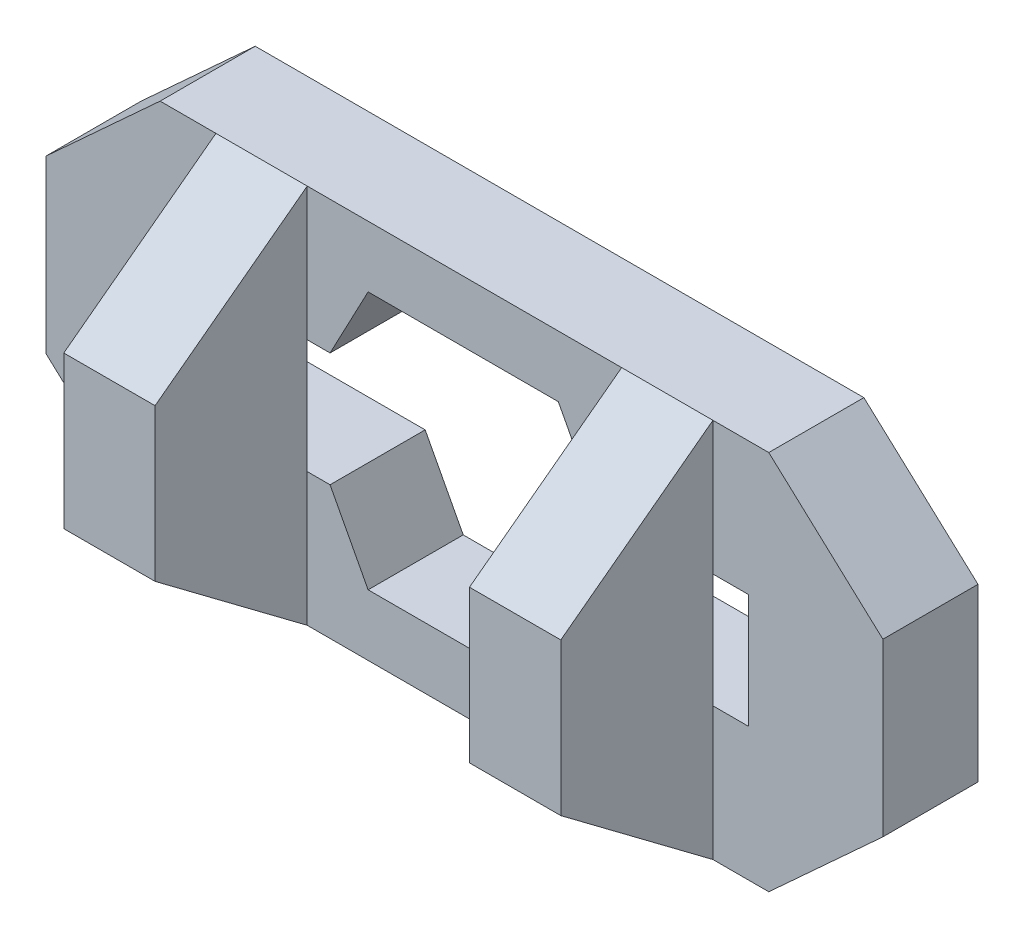
ISO-10303-21;
HEADER;
FILE_DESCRIPTION(('STEP AP214'),'2;1');
FILE_NAME('part.step','',(''),(''),'','','');
FILE_SCHEMA(('AUTOMOTIVE_DESIGN { 1 0 10303 214 1 1 1 1 }'));
ENDSEC;
DATA;
#1=APPLICATION_CONTEXT('core data for automotive mechanical design processes');
#2=APPLICATION_PROTOCOL_DEFINITION('international standard','automotive_design',2000,#1);
#3=PRODUCT_CONTEXT('',#1,'mechanical');
#4=PRODUCT('Part','Part','',(#3));
#5=PRODUCT_RELATED_PRODUCT_CATEGORY('part','',(#4));
#6=PRODUCT_DEFINITION_FORMATION('','',#4);
#7=PRODUCT_DEFINITION_CONTEXT('part definition',#1,'design');
#8=PRODUCT_DEFINITION('design','',#6,#7);
#9=PRODUCT_DEFINITION_SHAPE('','',#8);
#10=(LENGTH_UNIT() NAMED_UNIT(*) SI_UNIT(.MILLI.,.METRE.));
#11=(NAMED_UNIT(*) PLANE_ANGLE_UNIT() SI_UNIT($,.RADIAN.));
#12=(NAMED_UNIT(*) SI_UNIT($,.STERADIAN.) SOLID_ANGLE_UNIT());
#13=UNCERTAINTY_MEASURE_WITH_UNIT(LENGTH_MEASURE(1.E-05),#10,'distance_accuracy_value','');
#14=(GEOMETRIC_REPRESENTATION_CONTEXT(3) GLOBAL_UNCERTAINTY_ASSIGNED_CONTEXT((#13)) GLOBAL_UNIT_ASSIGNED_CONTEXT((#10,
#11,#12)) REPRESENTATION_CONTEXT('',''));
#15=CARTESIAN_POINT('',(0.,0.,0.));
#16=DIRECTION('',(0.,0.,1.));
#17=DIRECTION('',(1.,0.,0.));
#18=AXIS2_PLACEMENT_3D('',#15,#16,#17);
#19=CARTESIAN_POINT('',(-134.545454545455,0.,25.));
#20=DIRECTION('',(0.,0.,1.));
#21=DIRECTION('',(1.,0.,0.));
#22=AXIS2_PLACEMENT_3D('',#19,#20,#21);
#23=PLANE('',#22);
#24=DIRECTION('',(-1.,0.,0.));
#25=VECTOR('',#24,1.);
#26=CARTESIAN_POINT('',(-80.,50.,25.));
#27=LINE('',#26,#25);
#28=CARTESIAN_POINT('',(80.,50.,25.));
#29=VERTEX_POINT('',#28);
#30=CARTESIAN_POINT('',(65.3250786988458,50.,25.));
#31=VERTEX_POINT('',#30);
#32=EDGE_CURVE('E355',#29,#31,#27,.T.);
#33=ORIENTED_EDGE('',*,*,#32,.T.);
#34=DIRECTION('',(0.,-1.,0.));
#35=VECTOR('',#34,1.);
#36=CARTESIAN_POINT('',(65.3250786988458,-50.,25.));
#37=LINE('',#36,#35);
#38=CARTESIAN_POINT('',(65.3250786988457,15.,25.));
#39=VERTEX_POINT('',#38);
#40=EDGE_CURVE('E418',#31,#39,#37,.T.);
#41=ORIENTED_EDGE('',*,*,#40,.T.);
#42=DIRECTION('',(-1.,0.,0.));
#43=VECTOR('',#42,1.);
#44=CARTESIAN_POINT('',(34.6749213011542,15.,25.));
#45=LINE('',#44,#43);
#46=CARTESIAN_POINT('',(74.6749213011543,15.,25.));
#47=VERTEX_POINT('',#46);
#48=EDGE_CURVE('E602',#47,#39,#45,.T.);
#49=ORIENTED_EDGE('',*,*,#48,.F.);
#50=DIRECTION('',(0.,1.,0.));
#51=VECTOR('',#50,1.);
#52=CARTESIAN_POINT('',(74.6749213011543,15.,25.));
#53=LINE('',#52,#51);
#54=CARTESIAN_POINT('',(74.6749213011543,-15.,25.));
#55=VERTEX_POINT('',#54);
#56=EDGE_CURVE('E608',#55,#47,#53,.T.);
#57=ORIENTED_EDGE('',*,*,#56,.F.);
#58=DIRECTION('',(1.,0.,0.));
#59=VECTOR('',#58,1.);
#60=CARTESIAN_POINT('',(34.6749213011541,-15.,25.));
#61=LINE('',#60,#59);
#62=CARTESIAN_POINT('',(65.3250786988457,-15.,25.));
#63=VERTEX_POINT('',#62);
#64=EDGE_CURVE('E300',#63,#55,#61,.T.);
#65=ORIENTED_EDGE('',*,*,#64,.F.);
#66=CARTESIAN_POINT('',(65.3250786988458,-50.,25.));
#67=VERTEX_POINT('',#66);
#68=EDGE_CURVE('E270',#63,#67,#37,.T.);
#69=ORIENTED_EDGE('',*,*,#68,.T.);
#70=DIRECTION('',(1.,0.,0.));
#71=VECTOR('',#70,1.);
#72=CARTESIAN_POINT('',(-80.,-50.,25.));
#73=LINE('',#72,#71);
#74=CARTESIAN_POINT('',(80.,-50.,25.));
#75=VERTEX_POINT('',#74);
#76=EDGE_CURVE('E297',#67,#75,#73,.T.);
#77=ORIENTED_EDGE('',*,*,#76,.T.);
#78=DIRECTION('',(0.737154140200742,0.675724628517346,0.));
#79=VECTOR('',#78,1.);
#80=CARTESIAN_POINT('',(110.,-22.5,25.));
#81=LINE('',#80,#79);
#82=CARTESIAN_POINT('',(110.,-22.5,25.));
#83=VERTEX_POINT('',#82);
#84=EDGE_CURVE('E325',#75,#83,#81,.T.);
#85=ORIENTED_EDGE('',*,*,#84,.T.);
#86=DIRECTION('',(0.,1.,0.));
#87=VECTOR('',#86,1.);
#88=CARTESIAN_POINT('',(110.,22.5,25.));
#89=LINE('',#88,#87);
#90=CARTESIAN_POINT('',(110.,22.5,25.));
#91=VERTEX_POINT('',#90);
#92=EDGE_CURVE('E394',#83,#91,#89,.T.);
#93=ORIENTED_EDGE('',*,*,#92,.T.);
#94=DIRECTION('',(-0.737154140200742,0.675724628517346,0.));
#95=VECTOR('',#94,1.);
#96=CARTESIAN_POINT('',(80.,50.,25.));
#97=LINE('',#96,#95);
#98=EDGE_CURVE('E376',#91,#29,#97,.T.);
#99=ORIENTED_EDGE('',*,*,#98,.T.);
#100=EDGE_LOOP('',(#33,#41,#49,#57,#65,#69,#77,#85,#93,#99));
#101=FACE_BOUND('',#100,.T.);
#102=ADVANCED_FACE('F55',(#101),#23,.T.);
#103=CARTESIAN_POINT('',(-41.3250786988458,-50.,25.));
#104=VERTEX_POINT('',#103);
#105=CARTESIAN_POINT('',(41.3250786988458,-50.,25.));
#106=VERTEX_POINT('',#105);
#107=EDGE_CURVE('E307',#104,#106,#73,.T.);
#108=ORIENTED_EDGE('',*,*,#107,.T.);
#109=DIRECTION('',(0.,1.,0.));
#110=VECTOR('',#109,1.);
#111=CARTESIAN_POINT('',(41.3250786988458,-50.,25.));
#112=LINE('',#111,#110);
#113=CARTESIAN_POINT('',(41.3250786988458,-15.,25.));
#114=VERTEX_POINT('',#113);
#115=EDGE_CURVE('E292',#106,#114,#112,.T.);
#116=ORIENTED_EDGE('',*,*,#115,.T.);
#117=CARTESIAN_POINT('',(34.6749213011541,-15.,25.));
#118=VERTEX_POINT('',#117);
#119=EDGE_CURVE('E615',#118,#114,#61,.T.);
#120=ORIENTED_EDGE('',*,*,#119,.F.);
#121=DIRECTION('',(0.467398091371973,0.884046958131657,0.));
#122=VECTOR('',#121,1.);
#123=CARTESIAN_POINT('',(24.6749213011542,-33.9142184029179,25.));
#124=LINE('',#123,#122);
#125=CARTESIAN_POINT('',(24.6749213011542,-33.9142184029179,25.));
#126=VERTEX_POINT('',#125);
#127=EDGE_CURVE('E619',#126,#118,#124,.T.);
#128=ORIENTED_EDGE('',*,*,#127,.F.);
#129=DIRECTION('',(1.,0.,0.));
#130=VECTOR('',#129,1.);
#131=CARTESIAN_POINT('',(-25.3250786988458,-33.9142184029179,25.));
#132=LINE('',#131,#130);
#133=CARTESIAN_POINT('',(-25.3250786988458,-33.9142184029179,25.));
#134=VERTEX_POINT('',#133);
#135=EDGE_CURVE('E622',#134,#126,#132,.T.);
#136=ORIENTED_EDGE('',*,*,#135,.F.);
#137=DIRECTION('',(0.467398091371975,-0.884046958131657,0.));
#138=VECTOR('',#137,1.);
#139=CARTESIAN_POINT('',(-35.3250786988457,-15.,25.));
#140=LINE('',#139,#138);
#141=CARTESIAN_POINT('',(-35.3250786988457,-15.,25.));
#142=VERTEX_POINT('',#141);
#143=EDGE_CURVE('E624',#142,#134,#140,.T.);
#144=ORIENTED_EDGE('',*,*,#143,.F.);
#145=DIRECTION('',(1.,0.,0.));
#146=VECTOR('',#145,1.);
#147=CARTESIAN_POINT('',(-75.3250786988457,-15.,25.));
#148=LINE('',#147,#146);
#149=CARTESIAN_POINT('',(-41.3250786988458,-15.,25.));
#150=VERTEX_POINT('',#149);
#151=EDGE_CURVE('E637',#150,#142,#148,.T.);
#152=ORIENTED_EDGE('',*,*,#151,.F.);
#153=DIRECTION('',(0.,1.,0.));
#154=VECTOR('',#153,1.);
#155=CARTESIAN_POINT('',(-41.3250786988458,-50.,25.));
#156=LINE('',#155,#154);
#157=EDGE_CURVE('E573',#104,#150,#156,.T.);
#158=ORIENTED_EDGE('',*,*,#157,.F.);
#159=EDGE_LOOP('',(#108,#116,#120,#128,#136,#144,#152,#158));
#160=FACE_BOUND('',#159,.T.);
#161=ADVANCED_FACE('F770',(#160),#23,.T.);
#162=CARTESIAN_POINT('',(41.3250786988458,15.,25.));
#163=VERTEX_POINT('',#162);
#164=CARTESIAN_POINT('',(34.6749213011542,15.,25.));
#165=VERTEX_POINT('',#164);
#166=EDGE_CURVE('E603',#163,#165,#45,.T.);
#167=ORIENTED_EDGE('',*,*,#166,.F.);
#168=CARTESIAN_POINT('',(41.3250786988458,50.,25.));
#169=VERTEX_POINT('',#168);
#170=EDGE_CURVE('E417',#163,#169,#112,.T.);
#171=ORIENTED_EDGE('',*,*,#170,.T.);
#172=CARTESIAN_POINT('',(-41.3250786988458,50.,25.));
#173=VERTEX_POINT('',#172);
#174=EDGE_CURVE('E317',#169,#173,#27,.T.);
#175=ORIENTED_EDGE('',*,*,#174,.T.);
#176=DIRECTION('',(0.,1.,0.));
#177=VECTOR('',#176,1.);
#178=CARTESIAN_POINT('',(-41.3250786988458,0.,25.));
#179=LINE('',#178,#177);
#180=CARTESIAN_POINT('',(-41.3250786988458,15.,25.));
#181=VERTEX_POINT('',#180);
#182=EDGE_CURVE('E65',#173,#181,#179,.F.);
#183=ORIENTED_EDGE('',*,*,#182,.T.);
#184=DIRECTION('',(-1.,0.,0.));
#185=VECTOR('',#184,1.);
#186=CARTESIAN_POINT('',(-75.3250786988457,15.,25.));
#187=LINE('',#186,#185);
#188=CARTESIAN_POINT('',(-35.3250786988457,15.,25.));
#189=VERTEX_POINT('',#188);
#190=EDGE_CURVE('E643',#189,#181,#187,.T.);
#191=ORIENTED_EDGE('',*,*,#190,.F.);
#192=DIRECTION('',(-0.46739809137198,-0.884046958131654,0.));
#193=VECTOR('',#192,1.);
#194=CARTESIAN_POINT('',(-35.3250786988457,15.,25.));
#195=LINE('',#194,#193);
#196=CARTESIAN_POINT('',(-25.3250786988457,33.9142184029179,25.));
#197=VERTEX_POINT('',#196);
#198=EDGE_CURVE('E648',#197,#189,#195,.T.);
#199=ORIENTED_EDGE('',*,*,#198,.F.);
#200=DIRECTION('',(-1.,0.,0.));
#201=VECTOR('',#200,1.);
#202=CARTESIAN_POINT('',(-25.3250786988457,33.9142184029179,25.));
#203=LINE('',#202,#201);
#204=CARTESIAN_POINT('',(24.6749213011543,33.9142184029179,25.));
#205=VERTEX_POINT('',#204);
#206=EDGE_CURVE('E657',#205,#197,#203,.T.);
#207=ORIENTED_EDGE('',*,*,#206,.F.);
#208=DIRECTION('',(-0.467398091371975,0.884046958131657,0.));
#209=VECTOR('',#208,1.);
#210=CARTESIAN_POINT('',(24.6749213011543,33.9142184029179,25.));
#211=LINE('',#210,#209);
#212=EDGE_CURVE('E610',#165,#205,#211,.T.);
#213=ORIENTED_EDGE('',*,*,#212,.F.);
#214=EDGE_LOOP('',(#167,#171,#175,#183,#191,#199,#207,#213));
#215=FACE_BOUND('',#214,.T.);
#216=ADVANCED_FACE('F776',(#215),#23,.T.);
#217=CARTESIAN_POINT('',(-80.,-50.,25.));
#218=VERTEX_POINT('',#217);
#219=CARTESIAN_POINT('',(-65.3250786988458,-50.,25.));
#220=VERTEX_POINT('',#219);
#221=EDGE_CURVE('E310',#218,#220,#73,.T.);
#222=ORIENTED_EDGE('',*,*,#221,.T.);
#223=DIRECTION('',(0.,1.,0.));
#224=VECTOR('',#223,1.);
#225=CARTESIAN_POINT('',(-65.3250786988458,0.,25.));
#226=LINE('',#225,#224);
#227=CARTESIAN_POINT('',(-65.3250786988457,-15.,25.));
#228=VERTEX_POINT('',#227);
#229=EDGE_CURVE('E12',#220,#228,#226,.T.);
#230=ORIENTED_EDGE('',*,*,#229,.T.);
#231=CARTESIAN_POINT('',(-75.3250786988457,-15.,25.));
#232=VERTEX_POINT('',#231);
#233=EDGE_CURVE('E626',#232,#228,#148,.T.);
#234=ORIENTED_EDGE('',*,*,#233,.F.);
#235=DIRECTION('',(0.,-1.,0.));
#236=VECTOR('',#235,1.);
#237=CARTESIAN_POINT('',(-75.3250786988457,15.,25.));
#238=LINE('',#237,#236);
#239=CARTESIAN_POINT('',(-75.3250786988457,15.,25.));
#240=VERTEX_POINT('',#239);
#241=EDGE_CURVE('E629',#240,#232,#238,.T.);
#242=ORIENTED_EDGE('',*,*,#241,.F.);
#243=CARTESIAN_POINT('',(-65.3250786988457,15.,25.));
#244=VERTEX_POINT('',#243);
#245=EDGE_CURVE('E644',#244,#240,#187,.T.);
#246=ORIENTED_EDGE('',*,*,#245,.F.);
#247=DIRECTION('',(0.,-1.,0.));
#248=VECTOR('',#247,1.);
#249=CARTESIAN_POINT('',(-65.3250786988458,-50.,25.));
#250=LINE('',#249,#248);
#251=CARTESIAN_POINT('',(-65.3250786988458,50.,25.));
#252=VERTEX_POINT('',#251);
#253=EDGE_CURVE('E582',#252,#244,#250,.T.);
#254=ORIENTED_EDGE('',*,*,#253,.F.);
#255=CARTESIAN_POINT('',(-80.,50.,25.));
#256=VERTEX_POINT('',#255);
#257=EDGE_CURVE('E380',#252,#256,#27,.T.);
#258=ORIENTED_EDGE('',*,*,#257,.T.);
#259=DIRECTION('',(-0.737154140200741,-0.675724628517346,0.));
#260=VECTOR('',#259,1.);
#261=CARTESIAN_POINT('',(-80.,50.,25.));
#262=LINE('',#261,#260);
#263=CARTESIAN_POINT('',(-110.,22.5,25.));
#264=VERTEX_POINT('',#263);
#265=EDGE_CURVE('E358',#256,#264,#262,.T.);
#266=ORIENTED_EDGE('',*,*,#265,.T.);
#267=DIRECTION('',(0.,-1.,0.));
#268=VECTOR('',#267,1.);
#269=CARTESIAN_POINT('',(-110.,22.5,25.));
#270=LINE('',#269,#268);
#271=CARTESIAN_POINT('',(-110.,-22.5,25.));
#272=VERTEX_POINT('',#271);
#273=EDGE_CURVE('E312',#264,#272,#270,.T.);
#274=ORIENTED_EDGE('',*,*,#273,.T.);
#275=DIRECTION('',(0.737154140200741,-0.675724628517346,0.));
#276=VECTOR('',#275,1.);
#277=CARTESIAN_POINT('',(-110.,-22.5,25.));
#278=LINE('',#277,#276);
#279=EDGE_CURVE('E308',#272,#218,#278,.T.);
#280=ORIENTED_EDGE('',*,*,#279,.T.);
#281=EDGE_LOOP('',(#222,#230,#234,#242,#246,#254,#258,#266,#274,#280));
#282=FACE_BOUND('',#281,.T.);
#283=ADVANCED_FACE('F772',(#282),#23,.T.);
#284=CARTESIAN_POINT('',(-134.545454545455,0.,0.));
#285=DIRECTION('',(0.,0.,1.));
#286=DIRECTION('',(1.,0.,0.));
#287=AXIS2_PLACEMENT_3D('',#284,#285,#286);
#288=PLANE('',#287);
#289=DIRECTION('',(-0.737154140200741,-0.675724628517346,0.));
#290=VECTOR('',#289,1.);
#291=CARTESIAN_POINT('',(-80.,50.,0.));
#292=LINE('',#291,#290);
#293=CARTESIAN_POINT('',(-80.,50.,0.));
#294=VERTEX_POINT('',#293);
#295=CARTESIAN_POINT('',(-110.,22.5,0.));
#296=VERTEX_POINT('',#295);
#297=EDGE_CURVE('E371',#294,#296,#292,.T.);
#298=ORIENTED_EDGE('',*,*,#297,.F.);
#299=DIRECTION('',(-1.,0.,0.));
#300=VECTOR('',#299,1.);
#301=CARTESIAN_POINT('',(-80.,50.,0.));
#302=LINE('',#301,#300);
#303=CARTESIAN_POINT('',(80.,50.,0.));
#304=VERTEX_POINT('',#303);
#305=EDGE_CURVE('E356',#304,#294,#302,.T.);
#306=ORIENTED_EDGE('',*,*,#305,.F.);
#307=DIRECTION('',(-0.737154140200742,0.675724628517346,0.));
#308=VECTOR('',#307,1.);
#309=CARTESIAN_POINT('',(80.,50.,0.));
#310=LINE('',#309,#308);
#311=CARTESIAN_POINT('',(110.,22.5,0.));
#312=VERTEX_POINT('',#311);
#313=EDGE_CURVE('E359',#312,#304,#310,.T.);
#314=ORIENTED_EDGE('',*,*,#313,.F.);
#315=DIRECTION('',(0.,1.,0.));
#316=VECTOR('',#315,1.);
#317=CARTESIAN_POINT('',(110.,22.5,0.));
#318=LINE('',#317,#316);
#319=CARTESIAN_POINT('',(110.,-22.5,0.));
#320=VERTEX_POINT('',#319);
#321=EDGE_CURVE('E361',#320,#312,#318,.T.);
#322=ORIENTED_EDGE('',*,*,#321,.F.);
#323=DIRECTION('',(0.737154140200742,0.675724628517346,0.));
#324=VECTOR('',#323,1.);
#325=CARTESIAN_POINT('',(110.,-22.5,0.));
#326=LINE('',#325,#324);
#327=CARTESIAN_POINT('',(80.,-50.,0.));
#328=VERTEX_POINT('',#327);
#329=EDGE_CURVE('E363',#328,#320,#326,.T.);
#330=ORIENTED_EDGE('',*,*,#329,.F.);
#331=DIRECTION('',(1.,0.,0.));
#332=VECTOR('',#331,1.);
#333=CARTESIAN_POINT('',(-80.,-50.,0.));
#334=LINE('',#333,#332);
#335=CARTESIAN_POINT('',(-80.,-50.,0.));
#336=VERTEX_POINT('',#335);
#337=EDGE_CURVE('E365',#336,#328,#334,.T.);
#338=ORIENTED_EDGE('',*,*,#337,.F.);
#339=DIRECTION('',(0.737154140200741,-0.675724628517346,0.));
#340=VECTOR('',#339,1.);
#341=CARTESIAN_POINT('',(-110.,-22.5,0.));
#342=LINE('',#341,#340);
#343=CARTESIAN_POINT('',(-110.,-22.5,0.));
#344=VERTEX_POINT('',#343);
#345=EDGE_CURVE('E367',#344,#336,#342,.T.);
#346=ORIENTED_EDGE('',*,*,#345,.F.);
#347=DIRECTION('',(0.,-1.,0.));
#348=VECTOR('',#347,1.);
#349=CARTESIAN_POINT('',(-110.,22.5,0.));
#350=LINE('',#349,#348);
#351=EDGE_CURVE('E369',#296,#344,#350,.T.);
#352=ORIENTED_EDGE('',*,*,#351,.F.);
#353=EDGE_LOOP('',(#298,#306,#314,#322,#330,#338,#346,#352));
#354=FACE_BOUND('',#353,.T.);
#355=DIRECTION('',(0.,-1.,0.));
#356=VECTOR('',#355,1.);
#357=CARTESIAN_POINT('',(-75.3250786988457,15.,0.));
#358=LINE('',#357,#356);
#359=CARTESIAN_POINT('',(-75.3250786988457,15.,0.));
#360=VERTEX_POINT('',#359);
#361=CARTESIAN_POINT('',(-75.3250786988457,-15.,0.));
#362=VERTEX_POINT('',#361);
#363=EDGE_CURVE('E595',#360,#362,#358,.T.);
#364=ORIENTED_EDGE('',*,*,#363,.T.);
#365=DIRECTION('',(1.,0.,0.));
#366=VECTOR('',#365,1.);
#367=CARTESIAN_POINT('',(-75.3250786988457,-15.,0.));
#368=LINE('',#367,#366);
#369=CARTESIAN_POINT('',(-35.3250786988457,-15.,0.));
#370=VERTEX_POINT('',#369);
#371=EDGE_CURVE('E953',#362,#370,#368,.T.);
#372=ORIENTED_EDGE('',*,*,#371,.T.);
#373=DIRECTION('',(0.467398091371975,-0.884046958131657,0.));
#374=VECTOR('',#373,1.);
#375=CARTESIAN_POINT('',(-35.3250786988457,-15.,0.));
#376=LINE('',#375,#374);
#377=CARTESIAN_POINT('',(-25.3250786988458,-33.9142184029179,0.));
#378=VERTEX_POINT('',#377);
#379=EDGE_CURVE('E951',#370,#378,#376,.T.);
#380=ORIENTED_EDGE('',*,*,#379,.T.);
#381=DIRECTION('',(1.,0.,0.));
#382=VECTOR('',#381,1.);
#383=CARTESIAN_POINT('',(-25.3250786988458,-33.9142184029179,0.));
#384=LINE('',#383,#382);
#385=CARTESIAN_POINT('',(24.6749213011542,-33.9142184029179,0.));
#386=VERTEX_POINT('',#385);
#387=EDGE_CURVE('E948',#378,#386,#384,.T.);
#388=ORIENTED_EDGE('',*,*,#387,.T.);
#389=DIRECTION('',(0.467398091371973,0.884046958131657,0.));
#390=VECTOR('',#389,1.);
#391=CARTESIAN_POINT('',(24.6749213011542,-33.9142184029179,0.));
#392=LINE('',#391,#390);
#393=CARTESIAN_POINT('',(34.6749213011541,-15.,0.));
#394=VERTEX_POINT('',#393);
#395=EDGE_CURVE('E945',#386,#394,#392,.T.);
#396=ORIENTED_EDGE('',*,*,#395,.T.);
#397=DIRECTION('',(1.,0.,0.));
#398=VECTOR('',#397,1.);
#399=CARTESIAN_POINT('',(34.6749213011541,-15.,0.));
#400=LINE('',#399,#398);
#401=CARTESIAN_POINT('',(74.6749213011543,-15.,0.));
#402=VERTEX_POINT('',#401);
#403=EDGE_CURVE('E942',#394,#402,#400,.T.);
#404=ORIENTED_EDGE('',*,*,#403,.T.);
#405=DIRECTION('',(0.,1.,0.));
#406=VECTOR('',#405,1.);
#407=CARTESIAN_POINT('',(74.6749213011543,15.,0.));
#408=LINE('',#407,#406);
#409=CARTESIAN_POINT('',(74.6749213011543,15.,0.));
#410=VERTEX_POINT('',#409);
#411=EDGE_CURVE('E939',#402,#410,#408,.T.);
#412=ORIENTED_EDGE('',*,*,#411,.T.);
#413=DIRECTION('',(-1.,0.,0.));
#414=VECTOR('',#413,1.);
#415=CARTESIAN_POINT('',(34.6749213011542,15.,0.));
#416=LINE('',#415,#414);
#417=CARTESIAN_POINT('',(34.6749213011542,15.,0.));
#418=VERTEX_POINT('',#417);
#419=EDGE_CURVE('E936',#410,#418,#416,.T.);
#420=ORIENTED_EDGE('',*,*,#419,.T.);
#421=DIRECTION('',(-0.467398091371975,0.884046958131657,0.));
#422=VECTOR('',#421,1.);
#423=CARTESIAN_POINT('',(24.6749213011543,33.9142184029179,0.));
#424=LINE('',#423,#422);
#425=CARTESIAN_POINT('',(24.6749213011543,33.9142184029179,0.));
#426=VERTEX_POINT('',#425);
#427=EDGE_CURVE('E933',#418,#426,#424,.T.);
#428=ORIENTED_EDGE('',*,*,#427,.T.);
#429=DIRECTION('',(-1.,0.,0.));
#430=VECTOR('',#429,1.);
#431=CARTESIAN_POINT('',(-25.3250786988457,33.9142184029179,0.));
#432=LINE('',#431,#430);
#433=CARTESIAN_POINT('',(-25.3250786988457,33.9142184029179,0.));
#434=VERTEX_POINT('',#433);
#435=EDGE_CURVE('E930',#426,#434,#432,.T.);
#436=ORIENTED_EDGE('',*,*,#435,.T.);
#437=DIRECTION('',(-0.46739809137198,-0.884046958131654,0.));
#438=VECTOR('',#437,1.);
#439=CARTESIAN_POINT('',(-35.3250786988457,15.,0.));
#440=LINE('',#439,#438);
#441=CARTESIAN_POINT('',(-35.3250786988457,15.,0.));
#442=VERTEX_POINT('',#441);
#443=EDGE_CURVE('E927',#434,#442,#440,.T.);
#444=ORIENTED_EDGE('',*,*,#443,.T.);
#445=DIRECTION('',(-1.,0.,0.));
#446=VECTOR('',#445,1.);
#447=CARTESIAN_POINT('',(-75.3250786988457,15.,0.));
#448=LINE('',#447,#446);
#449=EDGE_CURVE('E924',#442,#360,#448,.T.);
#450=ORIENTED_EDGE('',*,*,#449,.T.);
#451=EDGE_LOOP('',(#364,#372,#380,#388,#396,#404,#412,#420,#428,#436,#444,#450));
#452=FACE_BOUND('',#451,.T.);
#453=ADVANCED_FACE('F767',(#354,#452),#288,.F.);
#454=CARTESIAN_POINT('',(-80.,50.,25.));
#455=DIRECTION('',(0.675724628517346,-0.737154140200741,0.));
#456=DIRECTION('',(0.737154140200741,0.675724628517346,0.));
#457=AXIS2_PLACEMENT_3D('',#454,#455,#456);
#458=PLANE('',#457);
#459=ORIENTED_EDGE('',*,*,#297,.T.);
#460=DIRECTION('',(0.,0.,-1.));
#461=VECTOR('',#460,1.);
#462=CARTESIAN_POINT('',(-110.,22.5,25.));
#463=LINE('',#462,#461);
#464=EDGE_CURVE('E333',#264,#296,#463,.T.);
#465=ORIENTED_EDGE('',*,*,#464,.F.);
#466=ORIENTED_EDGE('',*,*,#265,.F.);
#467=DIRECTION('',(0.,0.,-1.));
#468=VECTOR('',#467,1.);
#469=CARTESIAN_POINT('',(-80.,50.,25.));
#470=LINE('',#469,#468);
#471=EDGE_CURVE('E352',#256,#294,#470,.T.);
#472=ORIENTED_EDGE('',*,*,#471,.T.);
#473=EDGE_LOOP('',(#459,#465,#466,#472));
#474=FACE_BOUND('',#473,.T.);
#475=ADVANCED_FACE('F57',(#474),#458,.F.);
#476=CARTESIAN_POINT('',(-110.,22.5,25.));
#477=DIRECTION('',(1.,0.,0.));
#478=DIRECTION('',(0.,0.,-1.));
#479=AXIS2_PLACEMENT_3D('',#476,#477,#478);
#480=PLANE('',#479);
#481=ORIENTED_EDGE('',*,*,#351,.T.);
#482=DIRECTION('',(0.,0.,-1.));
#483=VECTOR('',#482,1.);
#484=CARTESIAN_POINT('',(-110.,-22.5,25.));
#485=LINE('',#484,#483);
#486=EDGE_CURVE('E336',#272,#344,#485,.T.);
#487=ORIENTED_EDGE('',*,*,#486,.F.);
#488=ORIENTED_EDGE('',*,*,#273,.F.);
#489=ORIENTED_EDGE('',*,*,#464,.T.);
#490=EDGE_LOOP('',(#481,#487,#488,#489));
#491=FACE_BOUND('',#490,.T.);
#492=ADVANCED_FACE('F760',(#491),#480,.F.);
#493=CARTESIAN_POINT('',(-110.,-22.5,25.));
#494=DIRECTION('',(0.675724628517346,0.737154140200741,0.));
#495=DIRECTION('',(-0.737154140200741,0.675724628517346,0.));
#496=AXIS2_PLACEMENT_3D('',#493,#494,#495);
#497=PLANE('',#496);
#498=ORIENTED_EDGE('',*,*,#345,.T.);
#499=DIRECTION('',(0.,0.,-1.));
#500=VECTOR('',#499,1.);
#501=CARTESIAN_POINT('',(-80.,-50.,25.));
#502=LINE('',#501,#500);
#503=EDGE_CURVE('E339',#218,#336,#502,.T.);
#504=ORIENTED_EDGE('',*,*,#503,.F.);
#505=ORIENTED_EDGE('',*,*,#279,.F.);
#506=ORIENTED_EDGE('',*,*,#486,.T.);
#507=EDGE_LOOP('',(#498,#504,#505,#506));
#508=FACE_BOUND('',#507,.T.);
#509=ADVANCED_FACE('F757',(#508),#497,.F.);
#510=CARTESIAN_POINT('',(-80.,-50.,25.));
#511=DIRECTION('',(0.,1.,0.));
#512=DIRECTION('',(0.,0.,1.));
#513=AXIS2_PLACEMENT_3D('',#510,#511,#512);
#514=PLANE('',#513);
#515=ORIENTED_EDGE('',*,*,#337,.T.);
#516=DIRECTION('',(0.,0.,-1.));
#517=VECTOR('',#516,1.);
#518=CARTESIAN_POINT('',(80.,-50.,25.));
#519=LINE('',#518,#517);
#520=EDGE_CURVE('E305',#75,#328,#519,.T.);
#521=ORIENTED_EDGE('',*,*,#520,.F.);
#522=ORIENTED_EDGE('',*,*,#76,.F.);
#523=DIRECTION('',(-1.,0.,0.));
#524=VECTOR('',#523,1.);
#525=CARTESIAN_POINT('',(65.3250786988458,-50.,25.));
#526=LINE('',#525,#524);
#527=EDGE_CURVE('E282',#67,#106,#526,.T.);
#528=ORIENTED_EDGE('',*,*,#527,.T.);
#529=ORIENTED_EDGE('',*,*,#107,.F.);
#530=DIRECTION('',(1.,0.,0.));
#531=VECTOR('',#530,1.);
#532=CARTESIAN_POINT('',(-65.3250786988458,-50.,25.));
#533=LINE('',#532,#531);
#534=EDGE_CURVE('E593',#220,#104,#533,.T.);
#535=ORIENTED_EDGE('',*,*,#534,.F.);
#536=ORIENTED_EDGE('',*,*,#221,.F.);
#537=ORIENTED_EDGE('',*,*,#503,.T.);
#538=EDGE_LOOP('',(#515,#521,#522,#528,#529,#535,#536,#537));
#539=FACE_BOUND('',#538,.T.);
#540=ADVANCED_FACE('F303',(#539),#514,.F.);
#541=CARTESIAN_POINT('',(110.,-22.5,25.));
#542=DIRECTION('',(-0.675724628517346,0.737154140200742,0.));
#543=DIRECTION('',(-0.737154140200742,-0.675724628517346,0.));
#544=AXIS2_PLACEMENT_3D('',#541,#542,#543);
#545=PLANE('',#544);
#546=ORIENTED_EDGE('',*,*,#329,.T.);
#547=DIRECTION('',(0.,0.,-1.));
#548=VECTOR('',#547,1.);
#549=CARTESIAN_POINT('',(110.,-22.5,25.));
#550=LINE('',#549,#548);
#551=EDGE_CURVE('E343',#83,#320,#550,.T.);
#552=ORIENTED_EDGE('',*,*,#551,.F.);
#553=ORIENTED_EDGE('',*,*,#84,.F.);
#554=ORIENTED_EDGE('',*,*,#520,.T.);
#555=EDGE_LOOP('',(#546,#552,#553,#554));
#556=FACE_BOUND('',#555,.T.);
#557=ADVANCED_FACE('F401',(#556),#545,.F.);
#558=CARTESIAN_POINT('',(110.,22.5,25.));
#559=DIRECTION('',(-1.,0.,0.));
#560=DIRECTION('',(0.,0.,1.));
#561=AXIS2_PLACEMENT_3D('',#558,#559,#560);
#562=PLANE('',#561);
#563=ORIENTED_EDGE('',*,*,#321,.T.);
#564=DIRECTION('',(0.,0.,-1.));
#565=VECTOR('',#564,1.);
#566=CARTESIAN_POINT('',(110.,22.5,25.));
#567=LINE('',#566,#565);
#568=EDGE_CURVE('E346',#91,#312,#567,.T.);
#569=ORIENTED_EDGE('',*,*,#568,.F.);
#570=ORIENTED_EDGE('',*,*,#92,.F.);
#571=ORIENTED_EDGE('',*,*,#551,.T.);
#572=EDGE_LOOP('',(#563,#569,#570,#571));
#573=FACE_BOUND('',#572,.T.);
#574=ADVANCED_FACE('F405',(#573),#562,.F.);
#575=CARTESIAN_POINT('',(80.,50.,25.));
#576=DIRECTION('',(-0.675724628517346,-0.737154140200742,0.));
#577=DIRECTION('',(0.737154140200742,-0.675724628517346,0.));
#578=AXIS2_PLACEMENT_3D('',#575,#576,#577);
#579=PLANE('',#578);
#580=ORIENTED_EDGE('',*,*,#313,.T.);
#581=DIRECTION('',(0.,0.,-1.));
#582=VECTOR('',#581,1.);
#583=CARTESIAN_POINT('',(80.,50.,25.));
#584=LINE('',#583,#582);
#585=EDGE_CURVE('E349',#29,#304,#584,.T.);
#586=ORIENTED_EDGE('',*,*,#585,.F.);
#587=ORIENTED_EDGE('',*,*,#98,.F.);
#588=ORIENTED_EDGE('',*,*,#568,.T.);
#589=EDGE_LOOP('',(#580,#586,#587,#588));
#590=FACE_BOUND('',#589,.T.);
#591=ADVANCED_FACE('F408',(#590),#579,.F.);
#592=CARTESIAN_POINT('',(-80.,50.,25.));
#593=DIRECTION('',(0.,-1.,0.));
#594=DIRECTION('',(0.,0.,-1.));
#595=AXIS2_PLACEMENT_3D('',#592,#593,#594);
#596=PLANE('',#595);
#597=ORIENTED_EDGE('',*,*,#305,.T.);
#598=ORIENTED_EDGE('',*,*,#471,.F.);
#599=ORIENTED_EDGE('',*,*,#257,.F.);
#600=DIRECTION('',(-1.,0.,0.));
#601=VECTOR('',#600,1.);
#602=CARTESIAN_POINT('',(-65.3250786988458,50.,25.));
#603=LINE('',#602,#601);
#604=EDGE_CURVE('E578',#173,#252,#603,.T.);
#605=ORIENTED_EDGE('',*,*,#604,.F.);
#606=ORIENTED_EDGE('',*,*,#174,.F.);
#607=DIRECTION('',(1.,0.,0.));
#608=VECTOR('',#607,1.);
#609=CARTESIAN_POINT('',(65.3250786988458,50.,25.));
#610=LINE('',#609,#608);
#611=EDGE_CURVE('E413',#169,#31,#610,.T.);
#612=ORIENTED_EDGE('',*,*,#611,.T.);
#613=ORIENTED_EDGE('',*,*,#32,.F.);
#614=ORIENTED_EDGE('',*,*,#585,.T.);
#615=EDGE_LOOP('',(#597,#598,#599,#605,#606,#612,#613,#614));
#616=FACE_BOUND('',#615,.T.);
#617=ADVANCED_FACE('F411',(#616),#596,.F.);
#618=CARTESIAN_POINT('',(-75.3250786988457,15.,25.));
#619=DIRECTION('',(1.,0.,0.));
#620=DIRECTION('',(0.,0.,-1.));
#621=AXIS2_PLACEMENT_3D('',#618,#619,#620);
#622=PLANE('',#621);
#623=ORIENTED_EDGE('',*,*,#363,.F.);
#624=DIRECTION('',(0.,0.,-1.));
#625=VECTOR('',#624,1.);
#626=CARTESIAN_POINT('',(-75.3250786988457,15.,25.));
#627=LINE('',#626,#625);
#628=EDGE_CURVE('E922',#240,#360,#627,.T.);
#629=ORIENTED_EDGE('',*,*,#628,.F.);
#630=ORIENTED_EDGE('',*,*,#241,.T.);
#631=DIRECTION('',(0.,0.,-1.));
#632=VECTOR('',#631,1.);
#633=CARTESIAN_POINT('',(-75.3250786988457,-15.,25.));
#634=LINE('',#633,#632);
#635=EDGE_CURVE('E373',#232,#362,#634,.T.);
#636=ORIENTED_EDGE('',*,*,#635,.T.);
#637=EDGE_LOOP('',(#623,#629,#630,#636));
#638=FACE_BOUND('',#637,.T.);
#639=ADVANCED_FACE('F959',(#638),#622,.T.);
#640=CARTESIAN_POINT('',(-75.3250786988457,-15.,25.));
#641=DIRECTION('',(0.,1.,0.));
#642=DIRECTION('',(0.,0.,1.));
#643=AXIS2_PLACEMENT_3D('',#640,#641,#642);
#644=PLANE('',#643);
#645=ORIENTED_EDGE('',*,*,#371,.F.);
#646=ORIENTED_EDGE('',*,*,#635,.F.);
#647=ORIENTED_EDGE('',*,*,#233,.T.);
#648=EDGE_CURVE('E633',#228,#150,#148,.T.);
#649=ORIENTED_EDGE('',*,*,#648,.T.);
#650=ORIENTED_EDGE('',*,*,#151,.T.);
#651=DIRECTION('',(0.,0.,-1.));
#652=VECTOR('',#651,1.);
#653=CARTESIAN_POINT('',(-35.3250786988457,-15.,25.));
#654=LINE('',#653,#652);
#655=EDGE_CURVE('E903',#142,#370,#654,.T.);
#656=ORIENTED_EDGE('',*,*,#655,.T.);
#657=EDGE_LOOP('',(#645,#646,#647,#649,#650,#656));
#658=FACE_BOUND('',#657,.T.);
#659=ADVANCED_FACE('F805',(#658),#644,.T.);
#660=CARTESIAN_POINT('',(-35.3250786988457,-15.,25.));
#661=DIRECTION('',(0.884046958131657,0.467398091371975,0.));
#662=DIRECTION('',(-0.467398091371975,0.884046958131656,0.));
#663=AXIS2_PLACEMENT_3D('',#660,#661,#662);
#664=PLANE('',#663);
#665=ORIENTED_EDGE('',*,*,#379,.F.);
#666=ORIENTED_EDGE('',*,*,#655,.F.);
#667=ORIENTED_EDGE('',*,*,#143,.T.);
#668=DIRECTION('',(0.,0.,-1.));
#669=VECTOR('',#668,1.);
#670=CARTESIAN_POINT('',(-25.3250786988458,-33.9142184029179,25.));
#671=LINE('',#670,#669);
#672=EDGE_CURVE('E905',#134,#378,#671,.T.);
#673=ORIENTED_EDGE('',*,*,#672,.T.);
#674=EDGE_LOOP('',(#665,#666,#667,#673));
#675=FACE_BOUND('',#674,.T.);
#676=ADVANCED_FACE('F987',(#675),#664,.T.);
#677=CARTESIAN_POINT('',(-25.3250786988458,-33.9142184029179,25.));
#678=DIRECTION('',(0.,1.,0.));
#679=DIRECTION('',(0.,0.,1.));
#680=AXIS2_PLACEMENT_3D('',#677,#678,#679);
#681=PLANE('',#680);
#682=ORIENTED_EDGE('',*,*,#387,.F.);
#683=ORIENTED_EDGE('',*,*,#672,.F.);
#684=ORIENTED_EDGE('',*,*,#135,.T.);
#685=DIRECTION('',(0.,0.,-1.));
#686=VECTOR('',#685,1.);
#687=CARTESIAN_POINT('',(24.6749213011542,-33.9142184029179,25.));
#688=LINE('',#687,#686);
#689=EDGE_CURVE('E907',#126,#386,#688,.T.);
#690=ORIENTED_EDGE('',*,*,#689,.T.);
#691=EDGE_LOOP('',(#682,#683,#684,#690));
#692=FACE_BOUND('',#691,.T.);
#693=ADVANCED_FACE('F983',(#692),#681,.T.);
#694=CARTESIAN_POINT('',(24.6749213011542,-33.9142184029179,25.));
#695=DIRECTION('',(-0.884046958131657,0.467398091371973,0.));
#696=DIRECTION('',(-0.467398091371973,-0.884046958131657,0.));
#697=AXIS2_PLACEMENT_3D('',#694,#695,#696);
#698=PLANE('',#697);
#699=ORIENTED_EDGE('',*,*,#395,.F.);
#700=ORIENTED_EDGE('',*,*,#689,.F.);
#701=ORIENTED_EDGE('',*,*,#127,.T.);
#702=DIRECTION('',(0.,0.,-1.));
#703=VECTOR('',#702,1.);
#704=CARTESIAN_POINT('',(34.6749213011541,-15.,25.));
#705=LINE('',#704,#703);
#706=EDGE_CURVE('E909',#118,#394,#705,.T.);
#707=ORIENTED_EDGE('',*,*,#706,.T.);
#708=EDGE_LOOP('',(#699,#700,#701,#707));
#709=FACE_BOUND('',#708,.T.);
#710=ADVANCED_FACE('F980',(#709),#698,.T.);
#711=CARTESIAN_POINT('',(34.6749213011541,-15.,25.));
#712=DIRECTION('',(0.,1.,0.));
#713=DIRECTION('',(0.,0.,1.));
#714=AXIS2_PLACEMENT_3D('',#711,#712,#713);
#715=PLANE('',#714);
#716=ORIENTED_EDGE('',*,*,#403,.F.);
#717=ORIENTED_EDGE('',*,*,#706,.F.);
#718=ORIENTED_EDGE('',*,*,#119,.T.);
#719=DIRECTION('',(-1.,0.,0.));
#720=VECTOR('',#719,1.);
#721=CARTESIAN_POINT('',(34.6749213011541,-15.,25.));
#722=LINE('',#721,#720);
#723=EDGE_CURVE('E291',#63,#114,#722,.T.);
#724=ORIENTED_EDGE('',*,*,#723,.F.);
#725=ORIENTED_EDGE('',*,*,#64,.T.);
#726=DIRECTION('',(0.,0.,-1.));
#727=VECTOR('',#726,1.);
#728=CARTESIAN_POINT('',(74.6749213011543,-15.,25.));
#729=LINE('',#728,#727);
#730=EDGE_CURVE('E911',#55,#402,#729,.T.);
#731=ORIENTED_EDGE('',*,*,#730,.T.);
#732=EDGE_LOOP('',(#716,#717,#718,#724,#725,#731));
#733=FACE_BOUND('',#732,.T.);
#734=ADVANCED_FACE('F974',(#733),#715,.T.);
#735=CARTESIAN_POINT('',(74.6749213011543,15.,25.));
#736=DIRECTION('',(-1.,0.,0.));
#737=DIRECTION('',(0.,0.,1.));
#738=AXIS2_PLACEMENT_3D('',#735,#736,#737);
#739=PLANE('',#738);
#740=ORIENTED_EDGE('',*,*,#411,.F.);
#741=ORIENTED_EDGE('',*,*,#730,.F.);
#742=ORIENTED_EDGE('',*,*,#56,.T.);
#743=DIRECTION('',(0.,0.,-1.));
#744=VECTOR('',#743,1.);
#745=CARTESIAN_POINT('',(74.6749213011543,15.,25.));
#746=LINE('',#745,#744);
#747=EDGE_CURVE('E674',#47,#410,#746,.T.);
#748=ORIENTED_EDGE('',*,*,#747,.T.);
#749=EDGE_LOOP('',(#740,#741,#742,#748));
#750=FACE_BOUND('',#749,.T.);
#751=ADVANCED_FACE('F972',(#750),#739,.T.);
#752=CARTESIAN_POINT('',(34.6749213011542,15.,25.));
#753=DIRECTION('',(0.,-1.,0.));
#754=DIRECTION('',(1.,0.,0.));
#755=AXIS2_PLACEMENT_3D('',#752,#753,#754);
#756=PLANE('',#755);
#757=ORIENTED_EDGE('',*,*,#419,.F.);
#758=ORIENTED_EDGE('',*,*,#747,.F.);
#759=ORIENTED_EDGE('',*,*,#48,.T.);
#760=EDGE_CURVE('E598',#39,#163,#45,.T.);
#761=ORIENTED_EDGE('',*,*,#760,.T.);
#762=ORIENTED_EDGE('',*,*,#166,.T.);
#763=DIRECTION('',(0.,0.,-1.));
#764=VECTOR('',#763,1.);
#765=CARTESIAN_POINT('',(34.6749213011542,15.,25.));
#766=LINE('',#765,#764);
#767=EDGE_CURVE('E914',#165,#418,#766,.T.);
#768=ORIENTED_EDGE('',*,*,#767,.T.);
#769=EDGE_LOOP('',(#757,#758,#759,#761,#762,#768));
#770=FACE_BOUND('',#769,.T.);
#771=ADVANCED_FACE('F673',(#770),#756,.T.);
#772=CARTESIAN_POINT('',(24.6749213011543,33.9142184029179,25.));
#773=DIRECTION('',(-0.884046958131657,-0.467398091371975,0.));
#774=DIRECTION('',(0.467398091371975,-0.884046958131656,0.));
#775=AXIS2_PLACEMENT_3D('',#772,#773,#774);
#776=PLANE('',#775);
#777=ORIENTED_EDGE('',*,*,#427,.F.);
#778=ORIENTED_EDGE('',*,*,#767,.F.);
#779=ORIENTED_EDGE('',*,*,#212,.T.);
#780=DIRECTION('',(0.,0.,-1.));
#781=VECTOR('',#780,1.);
#782=CARTESIAN_POINT('',(24.6749213011543,33.9142184029179,25.));
#783=LINE('',#782,#781);
#784=EDGE_CURVE('E916',#205,#426,#783,.T.);
#785=ORIENTED_EDGE('',*,*,#784,.T.);
#786=EDGE_LOOP('',(#777,#778,#779,#785));
#787=FACE_BOUND('',#786,.T.);
#788=ADVANCED_FACE('F967',(#787),#776,.T.);
#789=CARTESIAN_POINT('',(-25.3250786988457,33.9142184029179,25.));
#790=DIRECTION('',(0.,-1.,0.));
#791=DIRECTION('',(0.,0.,-1.));
#792=AXIS2_PLACEMENT_3D('',#789,#790,#791);
#793=PLANE('',#792);
#794=ORIENTED_EDGE('',*,*,#435,.F.);
#795=ORIENTED_EDGE('',*,*,#784,.F.);
#796=ORIENTED_EDGE('',*,*,#206,.T.);
#797=DIRECTION('',(0.,0.,-1.));
#798=VECTOR('',#797,1.);
#799=CARTESIAN_POINT('',(-25.3250786988457,33.9142184029179,25.));
#800=LINE('',#799,#798);
#801=EDGE_CURVE('E918',#197,#434,#800,.T.);
#802=ORIENTED_EDGE('',*,*,#801,.T.);
#803=EDGE_LOOP('',(#794,#795,#796,#802));
#804=FACE_BOUND('',#803,.T.);
#805=ADVANCED_FACE('F1139',(#804),#793,.T.);
#806=CARTESIAN_POINT('',(-35.3250786988457,15.,25.));
#807=DIRECTION('',(0.884046958131654,-0.46739809137198,0.));
#808=DIRECTION('',(0.46739809137198,0.884046958131654,0.));
#809=AXIS2_PLACEMENT_3D('',#806,#807,#808);
#810=PLANE('',#809);
#811=ORIENTED_EDGE('',*,*,#443,.F.);
#812=ORIENTED_EDGE('',*,*,#801,.F.);
#813=ORIENTED_EDGE('',*,*,#198,.T.);
#814=DIRECTION('',(0.,0.,-1.));
#815=VECTOR('',#814,1.);
#816=CARTESIAN_POINT('',(-35.3250786988457,15.,25.));
#817=LINE('',#816,#815);
#818=EDGE_CURVE('E920',#189,#442,#817,.T.);
#819=ORIENTED_EDGE('',*,*,#818,.T.);
#820=EDGE_LOOP('',(#811,#812,#813,#819));
#821=FACE_BOUND('',#820,.T.);
#822=ADVANCED_FACE('F964',(#821),#810,.T.);
#823=CARTESIAN_POINT('',(-75.3250786988457,15.,25.));
#824=DIRECTION('',(0.,-1.,0.));
#825=DIRECTION('',(0.,0.,-1.));
#826=AXIS2_PLACEMENT_3D('',#823,#824,#825);
#827=PLANE('',#826);
#828=ORIENTED_EDGE('',*,*,#449,.F.);
#829=ORIENTED_EDGE('',*,*,#818,.F.);
#830=ORIENTED_EDGE('',*,*,#190,.T.);
#831=EDGE_CURVE('E639',#181,#244,#187,.T.);
#832=ORIENTED_EDGE('',*,*,#831,.T.);
#833=ORIENTED_EDGE('',*,*,#245,.T.);
#834=ORIENTED_EDGE('',*,*,#628,.T.);
#835=EDGE_LOOP('',(#828,#829,#830,#832,#833,#834));
#836=FACE_BOUND('',#835,.T.);
#837=ADVANCED_FACE('F960',(#836),#827,.T.);
#838=CARTESIAN_POINT('',(-65.3250786988458,50.,25.));
#839=DIRECTION('',(0.,0.,-1.));
#840=DIRECTION('',(-1.,0.,0.));
#841=AXIS2_PLACEMENT_3D('',#838,#839,#840);
#842=PLANE('',#841);
#843=ORIENTED_EDGE('',*,*,#648,.F.);
#844=EDGE_CURVE('E585',#244,#228,#250,.T.);
#845=ORIENTED_EDGE('',*,*,#844,.F.);
#846=ORIENTED_EDGE('',*,*,#831,.F.);
#847=EDGE_CURVE('E576',#150,#181,#156,.T.);
#848=ORIENTED_EDGE('',*,*,#847,.F.);
#849=EDGE_LOOP('',(#843,#845,#846,#848));
#850=FACE_BOUND('',#849,.T.);
#851=ADVANCED_FACE('F699',(#850),#842,.T.);
#852=CARTESIAN_POINT('',(-65.3250786988458,-20.,65.));
#853=DIRECTION('',(0.,0.,1.));
#854=DIRECTION('',(1.,0.,0.));
#855=AXIS2_PLACEMENT_3D('',#852,#853,#854);
#856=PLANE('',#855);
#857=DIRECTION('',(0.,-1.,0.));
#858=VECTOR('',#857,1.);
#859=CARTESIAN_POINT('',(-65.3250786988458,20.,65.));
#860=LINE('',#859,#858);
#861=CARTESIAN_POINT('',(-65.3250786988458,20.,65.));
#862=VERTEX_POINT('',#861);
#863=CARTESIAN_POINT('',(-65.3250786988458,-20.,65.));
#864=VERTEX_POINT('',#863);
#865=EDGE_CURVE('E517',#862,#864,#860,.T.);
#866=ORIENTED_EDGE('',*,*,#865,.T.);
#867=DIRECTION('',(1.,0.,0.));
#868=VECTOR('',#867,1.);
#869=CARTESIAN_POINT('',(-65.3250786988458,-20.,65.));
#870=LINE('',#869,#868);
#871=CARTESIAN_POINT('',(-41.3250786988458,-20.,65.));
#872=VERTEX_POINT('',#871);
#873=EDGE_CURVE('E849',#864,#872,#870,.T.);
#874=ORIENTED_EDGE('',*,*,#873,.T.);
#875=DIRECTION('',(0.,1.,0.));
#876=VECTOR('',#875,1.);
#877=CARTESIAN_POINT('',(-41.3250786988458,20.,65.));
#878=LINE('',#877,#876);
#879=CARTESIAN_POINT('',(-41.3250786988458,20.,65.));
#880=VERTEX_POINT('',#879);
#881=EDGE_CURVE('E799',#872,#880,#878,.T.);
#882=ORIENTED_EDGE('',*,*,#881,.T.);
#883=DIRECTION('',(-1.,0.,0.));
#884=VECTOR('',#883,1.);
#885=CARTESIAN_POINT('',(-65.3250786988458,20.,65.));
#886=LINE('',#885,#884);
#887=EDGE_CURVE('E862',#880,#862,#886,.T.);
#888=ORIENTED_EDGE('',*,*,#887,.T.);
#889=EDGE_LOOP('',(#866,#874,#882,#888));
#890=FACE_BOUND('',#889,.T.);
#891=ADVANCED_FACE('F552',(#890),#856,.T.);
#892=CARTESIAN_POINT('',(-65.3250786988458,0.,91.6666666666667));
#893=DIRECTION('',(1.,0.,0.));
#894=DIRECTION('',(0.,1.,0.));
#895=AXIS2_PLACEMENT_3D('',#892,#893,#894);
#896=PLANE('',#895);
#897=DIRECTION('',(0.,0.6,0.8));
#898=VECTOR('',#897,1.);
#899=CARTESIAN_POINT('',(-65.3250786988458,-50.,25.));
#900=LINE('',#899,#898);
#901=EDGE_CURVE('E520',#220,#864,#900,.T.);
#902=ORIENTED_EDGE('',*,*,#901,.T.);
#903=ORIENTED_EDGE('',*,*,#865,.F.);
#904=DIRECTION('',(0.,-0.6,0.8));
#905=VECTOR('',#904,1.);
#906=CARTESIAN_POINT('',(-65.3250786988458,50.,25.));
#907=LINE('',#906,#905);
#908=EDGE_CURVE('E523',#252,#862,#907,.T.);
#909=ORIENTED_EDGE('',*,*,#908,.F.);
#910=ORIENTED_EDGE('',*,*,#253,.T.);
#911=ORIENTED_EDGE('',*,*,#844,.T.);
#912=ORIENTED_EDGE('',*,*,#229,.F.);
#913=EDGE_LOOP('',(#902,#903,#909,#910,#911,#912));
#914=FACE_BOUND('',#913,.T.);
#915=ADVANCED_FACE('F812',(#914),#896,.F.);
#916=CARTESIAN_POINT('',(-65.3250786988458,20.,65.));
#917=DIRECTION('',(0.,-0.8,-0.6));
#918=DIRECTION('',(0.,0.6,-0.8));
#919=AXIS2_PLACEMENT_3D('',#916,#917,#918);
#920=PLANE('',#919);
#921=ORIENTED_EDGE('',*,*,#908,.T.);
#922=ORIENTED_EDGE('',*,*,#887,.F.);
#923=DIRECTION('',(0.,-0.6,0.8));
#924=VECTOR('',#923,1.);
#925=CARTESIAN_POINT('',(-41.3250786988458,50.,25.));
#926=LINE('',#925,#924);
#927=EDGE_CURVE('E529',#173,#880,#926,.T.);
#928=ORIENTED_EDGE('',*,*,#927,.F.);
#929=ORIENTED_EDGE('',*,*,#604,.T.);
#930=EDGE_LOOP('',(#921,#922,#928,#929));
#931=FACE_BOUND('',#930,.T.);
#932=ADVANCED_FACE('F835',(#931),#920,.F.);
#933=CARTESIAN_POINT('',(-41.3250786988458,-20.,65.));
#934=DIRECTION('',(0.,0.8,-0.6));
#935=DIRECTION('',(0.,0.6,0.8));
#936=AXIS2_PLACEMENT_3D('',#933,#934,#935);
#937=PLANE('',#936);
#938=DIRECTION('',(0.,0.6,0.8));
#939=VECTOR('',#938,1.);
#940=CARTESIAN_POINT('',(-41.3250786988458,-50.,25.));
#941=LINE('',#940,#939);
#942=EDGE_CURVE('E524',#104,#872,#941,.T.);
#943=ORIENTED_EDGE('',*,*,#942,.T.);
#944=ORIENTED_EDGE('',*,*,#873,.F.);
#945=ORIENTED_EDGE('',*,*,#901,.F.);
#946=ORIENTED_EDGE('',*,*,#534,.T.);
#947=EDGE_LOOP('',(#943,#944,#945,#946));
#948=FACE_BOUND('',#947,.T.);
#949=ADVANCED_FACE('F548',(#948),#937,.F.);
#950=CARTESIAN_POINT('',(-41.3250786988458,0.,91.6666666666667));
#951=DIRECTION('',(-1.,0.,0.));
#952=DIRECTION('',(0.,-1.,0.));
#953=AXIS2_PLACEMENT_3D('',#950,#951,#952);
#954=PLANE('',#953);
#955=ORIENTED_EDGE('',*,*,#927,.T.);
#956=ORIENTED_EDGE('',*,*,#881,.F.);
#957=ORIENTED_EDGE('',*,*,#942,.F.);
#958=ORIENTED_EDGE('',*,*,#157,.T.);
#959=ORIENTED_EDGE('',*,*,#847,.T.);
#960=ORIENTED_EDGE('',*,*,#182,.F.);
#961=EDGE_LOOP('',(#955,#956,#957,#958,#959,#960));
#962=FACE_BOUND('',#961,.T.);
#963=ADVANCED_FACE('F538',(#962),#954,.F.);
#964=CARTESIAN_POINT('',(65.3250786988458,-20.,65.));
#965=DIRECTION('',(0.,0.,1.));
#966=DIRECTION('',(-1.,0.,0.));
#967=AXIS2_PLACEMENT_3D('',#964,#965,#966);
#968=PLANE('',#967);
#969=DIRECTION('',(0.,-1.,0.));
#970=VECTOR('',#969,1.);
#971=CARTESIAN_POINT('',(65.3250786988458,20.,65.));
#972=LINE('',#971,#970);
#973=CARTESIAN_POINT('',(65.3250786988458,20.,65.));
#974=VERTEX_POINT('',#973);
#975=CARTESIAN_POINT('',(65.3250786988458,-20.,65.));
#976=VERTEX_POINT('',#975);
#977=EDGE_CURVE('E273',#974,#976,#972,.T.);
#978=ORIENTED_EDGE('',*,*,#977,.F.);
#979=DIRECTION('',(1.,0.,0.));
#980=VECTOR('',#979,1.);
#981=CARTESIAN_POINT('',(65.3250786988458,20.,65.));
#982=LINE('',#981,#980);
#983=CARTESIAN_POINT('',(41.3250786988458,20.,65.));
#984=VERTEX_POINT('',#983);
#985=EDGE_CURVE('E678',#984,#974,#982,.T.);
#986=ORIENTED_EDGE('',*,*,#985,.F.);
#987=DIRECTION('',(0.,1.,0.));
#988=VECTOR('',#987,1.);
#989=CARTESIAN_POINT('',(41.3250786988458,20.,65.));
#990=LINE('',#989,#988);
#991=CARTESIAN_POINT('',(41.3250786988458,-20.,65.));
#992=VERTEX_POINT('',#991);
#993=EDGE_CURVE('E681',#992,#984,#990,.T.);
#994=ORIENTED_EDGE('',*,*,#993,.F.);
#995=DIRECTION('',(-1.,0.,0.));
#996=VECTOR('',#995,1.);
#997=CARTESIAN_POINT('',(65.3250786988458,-20.,65.));
#998=LINE('',#997,#996);
#999=EDGE_CURVE('E467',#976,#992,#998,.T.);
#1000=ORIENTED_EDGE('',*,*,#999,.F.);
#1001=EDGE_LOOP('',(#978,#986,#994,#1000));
#1002=FACE_BOUND('',#1001,.T.);
#1003=ADVANCED_FACE('F442',(#1002),#968,.T.);
#1004=CARTESIAN_POINT('',(65.3250786988458,50.,25.));
#1005=DIRECTION('',(0.,0.,-1.));
#1006=DIRECTION('',(1.,0.,0.));
#1007=AXIS2_PLACEMENT_3D('',#1004,#1005,#1006);
#1008=PLANE('',#1007);
#1009=EDGE_CURVE('E59',#39,#63,#37,.T.);
#1010=ORIENTED_EDGE('',*,*,#1009,.T.);
#1011=ORIENTED_EDGE('',*,*,#723,.T.);
#1012=EDGE_CURVE('E78',#114,#163,#112,.T.);
#1013=ORIENTED_EDGE('',*,*,#1012,.T.);
#1014=ORIENTED_EDGE('',*,*,#760,.F.);
#1015=EDGE_LOOP('',(#1010,#1011,#1013,#1014));
#1016=FACE_BOUND('',#1015,.T.);
#1017=ADVANCED_FACE('F433',(#1016),#1008,.T.);
#1018=CARTESIAN_POINT('',(65.3250786988458,0.,91.6666666666667));
#1019=DIRECTION('',(-1.,0.,0.));
#1020=DIRECTION('',(0.,1.,0.));
#1021=AXIS2_PLACEMENT_3D('',#1018,#1019,#1020);
#1022=PLANE('',#1021);
#1023=DIRECTION('',(0.,0.6,0.8));
#1024=VECTOR('',#1023,1.);
#1025=CARTESIAN_POINT('',(65.3250786988458,-50.,25.));
#1026=LINE('',#1025,#1024);
#1027=EDGE_CURVE('E266',#67,#976,#1026,.T.);
#1028=ORIENTED_EDGE('',*,*,#1027,.F.);
#1029=ORIENTED_EDGE('',*,*,#68,.F.);
#1030=ORIENTED_EDGE('',*,*,#1009,.F.);
#1031=ORIENTED_EDGE('',*,*,#40,.F.);
#1032=DIRECTION('',(0.,-0.6,0.8));
#1033=VECTOR('',#1032,1.);
#1034=CARTESIAN_POINT('',(65.3250786988458,50.,25.));
#1035=LINE('',#1034,#1033);
#1036=EDGE_CURVE('E278',#31,#974,#1035,.T.);
#1037=ORIENTED_EDGE('',*,*,#1036,.T.);
#1038=ORIENTED_EDGE('',*,*,#977,.T.);
#1039=EDGE_LOOP('',(#1028,#1029,#1030,#1031,#1037,#1038));
#1040=FACE_BOUND('',#1039,.T.);
#1041=ADVANCED_FACE('F268',(#1040),#1022,.F.);
#1042=CARTESIAN_POINT('',(65.3250786988458,20.,65.));
#1043=DIRECTION('',(0.,-0.8,-0.6));
#1044=DIRECTION('',(0.,0.6,-0.8));
#1045=AXIS2_PLACEMENT_3D('',#1042,#1043,#1044);
#1046=PLANE('',#1045);
#1047=ORIENTED_EDGE('',*,*,#1036,.F.);
#1048=ORIENTED_EDGE('',*,*,#611,.F.);
#1049=DIRECTION('',(0.,-0.6,0.8));
#1050=VECTOR('',#1049,1.);
#1051=CARTESIAN_POINT('',(41.3250786988458,50.,25.));
#1052=LINE('',#1051,#1050);
#1053=EDGE_CURVE('E497',#169,#984,#1052,.T.);
#1054=ORIENTED_EDGE('',*,*,#1053,.T.);
#1055=ORIENTED_EDGE('',*,*,#985,.T.);
#1056=EDGE_LOOP('',(#1047,#1048,#1054,#1055));
#1057=FACE_BOUND('',#1056,.T.);
#1058=ADVANCED_FACE('F447',(#1057),#1046,.F.);
#1059=CARTESIAN_POINT('',(41.3250786988458,-20.,65.));
#1060=DIRECTION('',(0.,0.8,-0.6));
#1061=DIRECTION('',(0.,0.6,0.8));
#1062=AXIS2_PLACEMENT_3D('',#1059,#1060,#1061);
#1063=PLANE('',#1062);
#1064=DIRECTION('',(0.,0.6,0.8));
#1065=VECTOR('',#1064,1.);
#1066=CARTESIAN_POINT('',(41.3250786988458,-50.,25.));
#1067=LINE('',#1066,#1065);
#1068=EDGE_CURVE('E279',#106,#992,#1067,.T.);
#1069=ORIENTED_EDGE('',*,*,#1068,.F.);
#1070=ORIENTED_EDGE('',*,*,#527,.F.);
#1071=ORIENTED_EDGE('',*,*,#1027,.T.);
#1072=ORIENTED_EDGE('',*,*,#999,.T.);
#1073=EDGE_LOOP('',(#1069,#1070,#1071,#1072));
#1074=FACE_BOUND('',#1073,.T.);
#1075=ADVANCED_FACE('F284',(#1074),#1063,.F.);
#1076=CARTESIAN_POINT('',(41.3250786988458,0.,91.6666666666667));
#1077=DIRECTION('',(1.,0.,0.));
#1078=DIRECTION('',(0.,-1.,0.));
#1079=AXIS2_PLACEMENT_3D('',#1076,#1077,#1078);
#1080=PLANE('',#1079);
#1081=ORIENTED_EDGE('',*,*,#1053,.F.);
#1082=ORIENTED_EDGE('',*,*,#170,.F.);
#1083=ORIENTED_EDGE('',*,*,#1012,.F.);
#1084=ORIENTED_EDGE('',*,*,#115,.F.);
#1085=ORIENTED_EDGE('',*,*,#1068,.T.);
#1086=ORIENTED_EDGE('',*,*,#993,.T.);
#1087=EDGE_LOOP('',(#1081,#1082,#1083,#1084,#1085,#1086));
#1088=FACE_BOUND('',#1087,.T.);
#1089=ADVANCED_FACE('F482',(#1088),#1080,.F.);
#1090=CLOSED_SHELL('',(#102,#161,#216,#283,#453,#475,#492,#509,#540,#557,#574,#591,#617,#639,
#659,#676,#693,#710,#734,#751,#771,#788,#805,#822,#837,#851,#891,#915,#932,#949,#963,#1003,
#1017,#1041,#1058,#1075,#1089));
#1091=MANIFOLD_SOLID_BREP('B2',#1090);
#1092=ADVANCED_BREP_SHAPE_REPRESENTATION('',(#18,#1091),#14);
#1093=SHAPE_DEFINITION_REPRESENTATION(#9,#1092);
ENDSEC;
END-ISO-10303-21;
